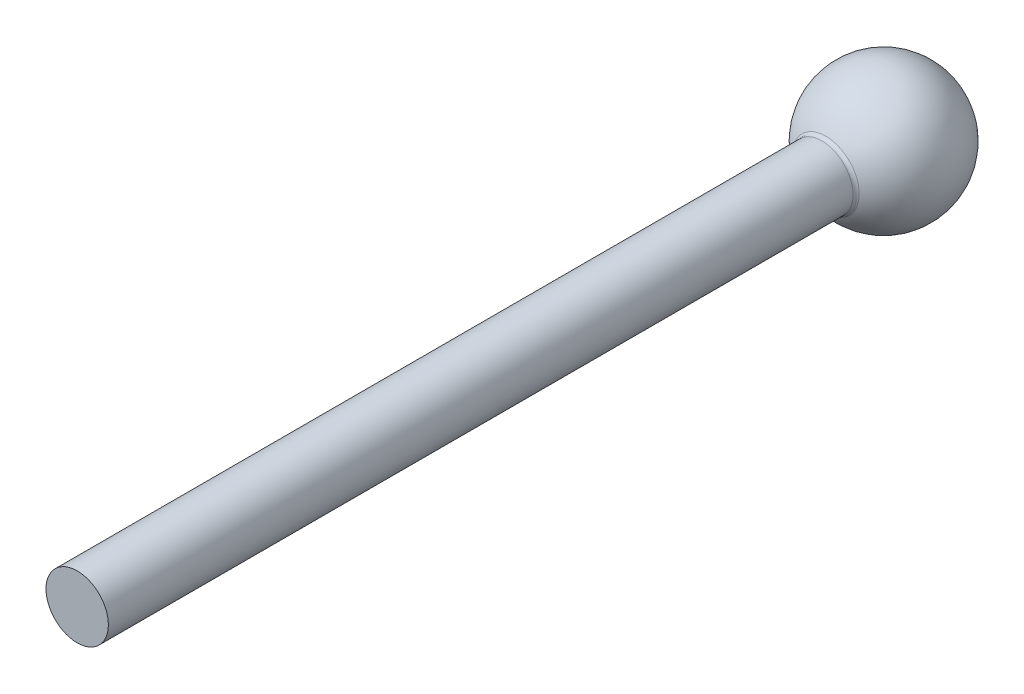
ISO-10303-21;
HEADER;
FILE_DESCRIPTION(('STEP AP214'),'2;1');
FILE_NAME('part.step','',(''),(''),'','','');
FILE_SCHEMA(('AUTOMOTIVE_DESIGN { 1 0 10303 214 1 1 1 1 }'));
ENDSEC;
DATA;
#1=APPLICATION_CONTEXT('core data for automotive mechanical design processes');
#2=APPLICATION_PROTOCOL_DEFINITION('international standard','automotive_design',2000,#1);
#3=PRODUCT_CONTEXT('',#1,'mechanical');
#4=PRODUCT('Part','Part','',(#3));
#5=PRODUCT_RELATED_PRODUCT_CATEGORY('part','',(#4));
#6=PRODUCT_DEFINITION_FORMATION('','',#4);
#7=PRODUCT_DEFINITION_CONTEXT('part definition',#1,'design');
#8=PRODUCT_DEFINITION('design','',#6,#7);
#9=PRODUCT_DEFINITION_SHAPE('','',#8);
#10=(LENGTH_UNIT() NAMED_UNIT(*) SI_UNIT(.MILLI.,.METRE.));
#11=(NAMED_UNIT(*) PLANE_ANGLE_UNIT() SI_UNIT($,.RADIAN.));
#12=(NAMED_UNIT(*) SI_UNIT($,.STERADIAN.) SOLID_ANGLE_UNIT());
#13=UNCERTAINTY_MEASURE_WITH_UNIT(LENGTH_MEASURE(1.E-05),#10,'distance_accuracy_value','');
#14=(GEOMETRIC_REPRESENTATION_CONTEXT(3) GLOBAL_UNCERTAINTY_ASSIGNED_CONTEXT((#13)) GLOBAL_UNIT_ASSIGNED_CONTEXT((#10,
#11,#12)) REPRESENTATION_CONTEXT('',''));
#15=CARTESIAN_POINT('',(0.,0.,0.));
#16=DIRECTION('',(0.,0.,1.));
#17=DIRECTION('',(1.,0.,0.));
#18=AXIS2_PLACEMENT_3D('',#15,#16,#17);
#19=CARTESIAN_POINT('',(0.,0.,-5.5));
#20=DIRECTION('',(0.,0.,-1.));
#21=DIRECTION('',(1.,0.,0.));
#22=AXIS2_PLACEMENT_3D('',#19,#20,#21);
#23=SPHERICAL_SURFACE('',#22,7.5);
#24=CARTESIAN_POINT('',(0.,0.,0.995190528383293));
#25=DIRECTION('',(0.,0.,-1.));
#26=DIRECTION('',(-1.,0.,0.));
#27=AXIS2_PLACEMENT_3D('',#24,#25,#26);
#28=CIRCLE('',#27,3.75);
#29=CARTESIAN_POINT('',(-3.75,0.,0.995190528383293));
#30=VERTEX_POINT('',#29);
#31=EDGE_CURVE('E10',#30,#30,#28,.T.);
#32=ORIENTED_EDGE('',*,*,#31,.T.);
#33=EDGE_LOOP('',(#32));
#34=FACE_BOUND('',#33,.T.);
#35=ADVANCED_FACE('F43',(#34),#23,.T.);
#36=CARTESIAN_POINT('',(0.,0.,85.));
#37=DIRECTION('',(0.,0.,-1.));
#38=DIRECTION('',(-1.,0.,0.));
#39=AXIS2_PLACEMENT_3D('',#36,#37,#38);
#40=CYLINDRICAL_SURFACE('',#39,3.5);
#41=CARTESIAN_POINT('',(0.,0.,1.42820323027552));
#42=DIRECTION('',(0.,0.,-1.));
#43=DIRECTION('',(-1.,0.,0.));
#44=AXIS2_PLACEMENT_3D('',#41,#42,#43);
#45=CIRCLE('',#44,3.5);
#46=CARTESIAN_POINT('',(-3.5,0.,1.42820323027552));
#47=VERTEX_POINT('',#46);
#48=EDGE_CURVE('E50',#47,#47,#45,.F.);
#49=ORIENTED_EDGE('',*,*,#48,.T.);
#50=EDGE_LOOP('',(#49));
#51=FACE_BOUND('',#50,.T.);
#52=CARTESIAN_POINT('',(0.,0.,85.));
#53=DIRECTION('',(0.,0.,1.));
#54=DIRECTION('',(1.,0.,0.));
#55=AXIS2_PLACEMENT_3D('',#52,#53,#54);
#56=CIRCLE('',#55,3.5);
#57=CARTESIAN_POINT('',(3.5,0.,85.));
#58=VERTEX_POINT('',#57);
#59=EDGE_CURVE('E54',#58,#58,#56,.T.);
#60=ORIENTED_EDGE('',*,*,#59,.F.);
#61=EDGE_LOOP('',(#60));
#62=FACE_BOUND('',#61,.T.);
#63=ADVANCED_FACE('F63',(#51,#62),#40,.T.);
#64=CARTESIAN_POINT('',(0.,0.,85.));
#65=DIRECTION('',(0.,0.,1.));
#66=DIRECTION('',(1.,0.,0.));
#67=AXIS2_PLACEMENT_3D('',#64,#65,#66);
#68=PLANE('',#67);
#69=ORIENTED_EDGE('',*,*,#59,.T.);
#70=EDGE_LOOP('',(#69));
#71=FACE_BOUND('',#70,.T.);
#72=ADVANCED_FACE('F61',(#71),#68,.T.);
#73=CARTESIAN_POINT('',(0.,0.,1.42820323027552));
#74=DIRECTION('',(0.,0.,-1.));
#75=DIRECTION('',(-1.,0.,0.));
#76=AXIS2_PLACEMENT_3D('',#73,#74,#75);
#77=TOROIDAL_SURFACE('',#76,4.,0.5);
#78=ORIENTED_EDGE('',*,*,#31,.F.);
#79=EDGE_LOOP('',(#78));
#80=FACE_BOUND('',#79,.T.);
#81=ORIENTED_EDGE('',*,*,#48,.F.);
#82=EDGE_LOOP('',(#81));
#83=FACE_BOUND('',#82,.T.);
#84=ADVANCED_FACE('F45',(#80,#83),#77,.F.);
#85=CLOSED_SHELL('',(#35,#63,#72,#84));
#86=MANIFOLD_SOLID_BREP('B2',#85);
#87=ADVANCED_BREP_SHAPE_REPRESENTATION('',(#18,#86),#14);
#88=SHAPE_DEFINITION_REPRESENTATION(#9,#87);
ENDSEC;
END-ISO-10303-21;
